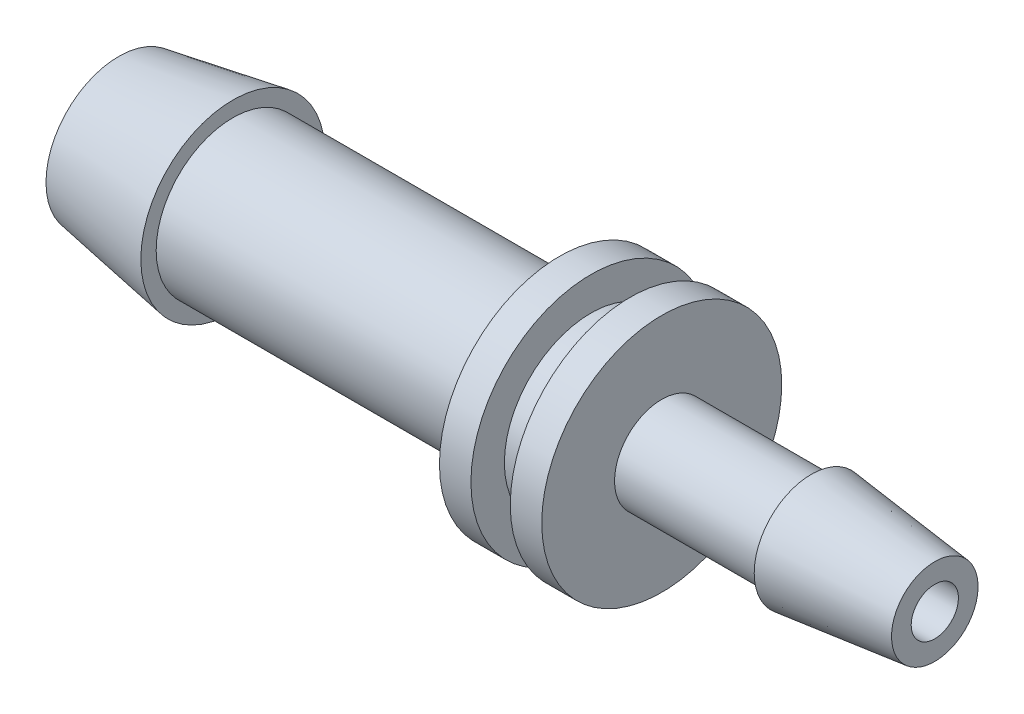
ISO-10303-21;
HEADER;
FILE_DESCRIPTION(('STEP AP214'),'2;1');
FILE_NAME('part.step','',(''),(''),'','','');
FILE_SCHEMA(('AUTOMOTIVE_DESIGN { 1 0 10303 214 1 1 1 1 }'));
ENDSEC;
DATA;
#1=APPLICATION_CONTEXT('core data for automotive mechanical design processes');
#2=APPLICATION_PROTOCOL_DEFINITION('international standard','automotive_design',2000,#1);
#3=PRODUCT_CONTEXT('',#1,'mechanical');
#4=PRODUCT('Part','Part','',(#3));
#5=PRODUCT_RELATED_PRODUCT_CATEGORY('part','',(#4));
#6=PRODUCT_DEFINITION_FORMATION('','',#4);
#7=PRODUCT_DEFINITION_CONTEXT('part definition',#1,'design');
#8=PRODUCT_DEFINITION('design','',#6,#7);
#9=PRODUCT_DEFINITION_SHAPE('','',#8);
#10=(LENGTH_UNIT() NAMED_UNIT(*) SI_UNIT(.MILLI.,.METRE.));
#11=(NAMED_UNIT(*) PLANE_ANGLE_UNIT() SI_UNIT($,.RADIAN.));
#12=(NAMED_UNIT(*) SI_UNIT($,.STERADIAN.) SOLID_ANGLE_UNIT());
#13=UNCERTAINTY_MEASURE_WITH_UNIT(LENGTH_MEASURE(1.E-05),#10,'distance_accuracy_value','');
#14=(GEOMETRIC_REPRESENTATION_CONTEXT(3) GLOBAL_UNCERTAINTY_ASSIGNED_CONTEXT((#13)) GLOBAL_UNIT_ASSIGNED_CONTEXT((#10,
#11,#12)) REPRESENTATION_CONTEXT('',''));
#15=CARTESIAN_POINT('',(0.,0.,0.));
#16=DIRECTION('',(0.,0.,1.));
#17=DIRECTION('',(1.,0.,0.));
#18=AXIS2_PLACEMENT_3D('',#15,#16,#17);
#19=CARTESIAN_POINT('',(3.683,2.9718,0.));
#20=DIRECTION('',(1.,0.,0.));
#21=DIRECTION('',(0.,0.,-1.));
#22=AXIS2_PLACEMENT_3D('',#19,#20,#21);
#23=PLANE('',#22);
#24=CARTESIAN_POINT('',(3.683,0.,0.));
#25=DIRECTION('',(-1.,0.,0.));
#26=DIRECTION('',(0.,0.,1.));
#27=AXIS2_PLACEMENT_3D('',#24,#25,#26);
#28=CIRCLE('',#27,2.4765);
#29=CARTESIAN_POINT('',(3.683,0.,2.4765));
#30=VERTEX_POINT('',#29);
#31=EDGE_CURVE('E447',#30,#30,#28,.T.);
#32=ORIENTED_EDGE('',*,*,#31,.T.);
#33=EDGE_LOOP('',(#32));
#34=FACE_BOUND('',#33,.T.);
#35=CARTESIAN_POINT('',(3.683,0.,0.));
#36=DIRECTION('',(-1.,0.,0.));
#37=DIRECTION('',(0.,0.,1.));
#38=AXIS2_PLACEMENT_3D('',#35,#36,#37);
#39=CIRCLE('',#38,2.9718);
#40=CARTESIAN_POINT('',(3.683,0.,2.9718));
#41=VERTEX_POINT('',#40);
#42=EDGE_CURVE('E11',#41,#41,#39,.T.);
#43=ORIENTED_EDGE('',*,*,#42,.F.);
#44=EDGE_LOOP('',(#43));
#45=FACE_BOUND('',#44,.T.);
#46=ADVANCED_FACE('F372',(#34,#45),#23,.T.);
#47=CARTESIAN_POINT('',(0.,0.,0.));
#48=DIRECTION('',(1.,0.,0.));
#49=DIRECTION('',(0.,0.,-1.));
#50=AXIS2_PLACEMENT_3D('',#47,#48,#49);
#51=CONICAL_SURFACE('',#50,2.3495,0.167384559658582);
#52=ORIENTED_EDGE('',*,*,#42,.T.);
#53=EDGE_LOOP('',(#52));
#54=FACE_BOUND('',#53,.T.);
#55=CARTESIAN_POINT('',(0.,0.,0.));
#56=DIRECTION('',(-1.,0.,0.));
#57=DIRECTION('',(0.,0.,1.));
#58=AXIS2_PLACEMENT_3D('',#55,#56,#57);
#59=CIRCLE('',#58,2.3495);
#60=CARTESIAN_POINT('',(0.,0.,2.3495));
#61=VERTEX_POINT('',#60);
#62=EDGE_CURVE('E381',#61,#61,#59,.T.);
#63=ORIENTED_EDGE('',*,*,#62,.F.);
#64=EDGE_LOOP('',(#63));
#65=FACE_BOUND('',#64,.T.);
#66=ADVANCED_FACE('F467',(#54,#65),#51,.T.);
#67=CARTESIAN_POINT('',(0.,2.3495,0.));
#68=DIRECTION('',(1.,0.,0.));
#69=DIRECTION('',(0.,0.,-1.));
#70=AXIS2_PLACEMENT_3D('',#67,#68,#69);
#71=PLANE('',#70);
#72=CARTESIAN_POINT('',(0.,0.,0.));
#73=DIRECTION('',(-1.,0.,0.));
#74=DIRECTION('',(0.,0.,1.));
#75=AXIS2_PLACEMENT_3D('',#72,#73,#74);
#76=CIRCLE('',#75,0.761999999999997);
#77=CARTESIAN_POINT('',(0.,0.,0.761999999999997));
#78=VERTEX_POINT('',#77);
#79=EDGE_CURVE('E386',#78,#78,#76,.T.);
#80=ORIENTED_EDGE('',*,*,#79,.F.);
#81=EDGE_LOOP('',(#80));
#82=FACE_BOUND('',#81,.T.);
#83=ORIENTED_EDGE('',*,*,#62,.T.);
#84=EDGE_LOOP('',(#83));
#85=FACE_BOUND('',#84,.T.);
#86=ADVANCED_FACE('F466',(#82,#85),#71,.F.);
#87=CARTESIAN_POINT('',(0.,0.,0.));
#88=DIRECTION('',(-1.,0.,0.));
#89=DIRECTION('',(0.,0.,1.));
#90=AXIS2_PLACEMENT_3D('',#87,#88,#89);
#91=CYLINDRICAL_SURFACE('',#90,0.761999999999998);
#92=ORIENTED_EDGE('',*,*,#79,.T.);
#93=EDGE_LOOP('',(#92));
#94=FACE_BOUND('',#93,.T.);
#95=CARTESIAN_POINT('',(26.3398,0.,0.));
#96=DIRECTION('',(-1.,0.,0.));
#97=DIRECTION('',(0.,0.,1.));
#98=AXIS2_PLACEMENT_3D('',#95,#96,#97);
#99=CIRCLE('',#98,0.762);
#100=CARTESIAN_POINT('',(26.3398,0.,0.762));
#101=VERTEX_POINT('',#100);
#102=EDGE_CURVE('E397',#101,#101,#99,.T.);
#103=ORIENTED_EDGE('',*,*,#102,.F.);
#104=EDGE_LOOP('',(#103));
#105=FACE_BOUND('',#104,.T.);
#106=ADVANCED_FACE('F475',(#94,#105),#91,.F.);
#107=CARTESIAN_POINT('',(26.3398,1.397,0.));
#108=DIRECTION('',(1.,0.,0.));
#109=DIRECTION('',(0.,0.,-1.));
#110=AXIS2_PLACEMENT_3D('',#107,#108,#109);
#111=PLANE('',#110);
#112=ORIENTED_EDGE('',*,*,#102,.T.);
#113=EDGE_LOOP('',(#112));
#114=FACE_BOUND('',#113,.T.);
#115=CARTESIAN_POINT('',(26.3398,0.,0.));
#116=DIRECTION('',(-1.,0.,0.));
#117=DIRECTION('',(0.,0.,1.));
#118=AXIS2_PLACEMENT_3D('',#115,#116,#117);
#119=CIRCLE('',#118,1.397);
#120=CARTESIAN_POINT('',(26.3398,0.,1.397));
#121=VERTEX_POINT('',#120);
#122=EDGE_CURVE('E405',#121,#121,#119,.T.);
#123=ORIENTED_EDGE('',*,*,#122,.F.);
#124=EDGE_LOOP('',(#123));
#125=FACE_BOUND('',#124,.T.);
#126=ADVANCED_FACE('F481',(#114,#125),#111,.T.);
#127=CARTESIAN_POINT('',(22.352,0.,0.));
#128=DIRECTION('',(-1.,0.,0.));
#129=DIRECTION('',(0.,0.,1.));
#130=AXIS2_PLACEMENT_3D('',#127,#128,#129);
#131=CONICAL_SURFACE('',#130,1.8415,0.111006749296676);
#132=ORIENTED_EDGE('',*,*,#122,.T.);
#133=EDGE_LOOP('',(#132));
#134=FACE_BOUND('',#133,.T.);
#135=CARTESIAN_POINT('',(22.352,0.,0.));
#136=DIRECTION('',(-1.,0.,0.));
#137=DIRECTION('',(0.,0.,1.));
#138=AXIS2_PLACEMENT_3D('',#135,#136,#137);
#139=CIRCLE('',#138,1.8415);
#140=CARTESIAN_POINT('',(22.352,0.,1.8415));
#141=VERTEX_POINT('',#140);
#142=EDGE_CURVE('E407',#141,#141,#139,.T.);
#143=ORIENTED_EDGE('',*,*,#142,.F.);
#144=EDGE_LOOP('',(#143));
#145=FACE_BOUND('',#144,.T.);
#146=ADVANCED_FACE('F484',(#134,#145),#131,.T.);
#147=CARTESIAN_POINT('',(22.352,1.524,0.));
#148=DIRECTION('',(-1.,0.,0.));
#149=DIRECTION('',(0.,0.,1.));
#150=AXIS2_PLACEMENT_3D('',#147,#148,#149);
#151=PLANE('',#150);
#152=ORIENTED_EDGE('',*,*,#142,.T.);
#153=EDGE_LOOP('',(#152));
#154=FACE_BOUND('',#153,.T.);
#155=CARTESIAN_POINT('',(22.352,0.,0.));
#156=DIRECTION('',(-1.,0.,0.));
#157=DIRECTION('',(0.,0.,1.));
#158=AXIS2_PLACEMENT_3D('',#155,#156,#157);
#159=CIRCLE('',#158,1.524);
#160=CARTESIAN_POINT('',(22.352,0.,1.524));
#161=VERTEX_POINT('',#160);
#162=EDGE_CURVE('E408',#161,#161,#159,.T.);
#163=ORIENTED_EDGE('',*,*,#162,.F.);
#164=EDGE_LOOP('',(#163));
#165=FACE_BOUND('',#164,.T.);
#166=ADVANCED_FACE('F487',(#154,#165),#151,.T.);
#167=CARTESIAN_POINT('',(0.,0.,0.));
#168=DIRECTION('',(-1.,0.,0.));
#169=DIRECTION('',(0.,0.,1.));
#170=AXIS2_PLACEMENT_3D('',#167,#168,#169);
#171=CYLINDRICAL_SURFACE('',#170,1.524);
#172=ORIENTED_EDGE('',*,*,#162,.T.);
#173=EDGE_LOOP('',(#172));
#174=FACE_BOUND('',#173,.T.);
#175=CARTESIAN_POINT('',(17.526,0.,0.));
#176=DIRECTION('',(-1.,0.,0.));
#177=DIRECTION('',(0.,0.,1.));
#178=AXIS2_PLACEMENT_3D('',#175,#176,#177);
#179=CIRCLE('',#178,1.524);
#180=CARTESIAN_POINT('',(17.526,0.,1.524));
#181=VERTEX_POINT('',#180);
#182=EDGE_CURVE('E414',#181,#181,#179,.T.);
#183=ORIENTED_EDGE('',*,*,#182,.F.);
#184=EDGE_LOOP('',(#183));
#185=FACE_BOUND('',#184,.T.);
#186=ADVANCED_FACE('F492',(#174,#185),#171,.T.);
#187=CARTESIAN_POINT('',(17.526,3.8735,0.));
#188=DIRECTION('',(1.,0.,0.));
#189=DIRECTION('',(0.,0.,-1.));
#190=AXIS2_PLACEMENT_3D('',#187,#188,#189);
#191=PLANE('',#190);
#192=ORIENTED_EDGE('',*,*,#182,.T.);
#193=EDGE_LOOP('',(#192));
#194=FACE_BOUND('',#193,.T.);
#195=CARTESIAN_POINT('',(17.526,0.,0.));
#196=DIRECTION('',(-1.,0.,0.));
#197=DIRECTION('',(0.,0.,1.));
#198=AXIS2_PLACEMENT_3D('',#195,#196,#197);
#199=CIRCLE('',#198,3.8735);
#200=CARTESIAN_POINT('',(17.526,0.,3.8735));
#201=VERTEX_POINT('',#200);
#202=EDGE_CURVE('E416',#201,#201,#199,.T.);
#203=ORIENTED_EDGE('',*,*,#202,.F.);
#204=EDGE_LOOP('',(#203));
#205=FACE_BOUND('',#204,.T.);
#206=ADVANCED_FACE('F500',(#194,#205),#191,.T.);
#207=CARTESIAN_POINT('',(0.,0.,0.));
#208=DIRECTION('',(-1.,0.,0.));
#209=DIRECTION('',(0.,0.,1.));
#210=AXIS2_PLACEMENT_3D('',#207,#208,#209);
#211=CYLINDRICAL_SURFACE('',#210,3.8735);
#212=ORIENTED_EDGE('',*,*,#202,.T.);
#213=EDGE_LOOP('',(#212));
#214=FACE_BOUND('',#213,.T.);
#215=CARTESIAN_POINT('',(16.51,0.,0.));
#216=DIRECTION('',(-1.,0.,0.));
#217=DIRECTION('',(0.,0.,1.));
#218=AXIS2_PLACEMENT_3D('',#215,#216,#217);
#219=CIRCLE('',#218,3.8735);
#220=CARTESIAN_POINT('',(16.51,0.,3.8735));
#221=VERTEX_POINT('',#220);
#222=EDGE_CURVE('E425',#221,#221,#219,.T.);
#223=ORIENTED_EDGE('',*,*,#222,.F.);
#224=EDGE_LOOP('',(#223));
#225=FACE_BOUND('',#224,.T.);
#226=ADVANCED_FACE('F502',(#214,#225),#211,.T.);
#227=CARTESIAN_POINT('',(16.51,2.794,0.));
#228=DIRECTION('',(-1.,0.,0.));
#229=DIRECTION('',(0.,0.,1.));
#230=AXIS2_PLACEMENT_3D('',#227,#228,#229);
#231=PLANE('',#230);
#232=ORIENTED_EDGE('',*,*,#222,.T.);
#233=EDGE_LOOP('',(#232));
#234=FACE_BOUND('',#233,.T.);
#235=CARTESIAN_POINT('',(16.51,0.,0.));
#236=DIRECTION('',(-1.,0.,0.));
#237=DIRECTION('',(0.,0.,1.));
#238=AXIS2_PLACEMENT_3D('',#235,#236,#237);
#239=CIRCLE('',#238,2.794);
#240=CARTESIAN_POINT('',(16.51,0.,2.794));
#241=VERTEX_POINT('',#240);
#242=EDGE_CURVE('E426',#241,#241,#239,.T.);
#243=ORIENTED_EDGE('',*,*,#242,.F.);
#244=EDGE_LOOP('',(#243));
#245=FACE_BOUND('',#244,.T.);
#246=ADVANCED_FACE('F503',(#234,#245),#231,.T.);
#247=CARTESIAN_POINT('',(0.,0.,0.));
#248=DIRECTION('',(-1.,0.,0.));
#249=DIRECTION('',(0.,0.,1.));
#250=AXIS2_PLACEMENT_3D('',#247,#248,#249);
#251=CYLINDRICAL_SURFACE('',#250,2.794);
#252=ORIENTED_EDGE('',*,*,#242,.T.);
#253=EDGE_LOOP('',(#252));
#254=FACE_BOUND('',#253,.T.);
#255=CARTESIAN_POINT('',(15.24,0.,0.));
#256=DIRECTION('',(-1.,0.,0.));
#257=DIRECTION('',(0.,0.,1.));
#258=AXIS2_PLACEMENT_3D('',#255,#256,#257);
#259=CIRCLE('',#258,2.794);
#260=CARTESIAN_POINT('',(15.24,0.,2.794));
#261=VERTEX_POINT('',#260);
#262=EDGE_CURVE('E429',#261,#261,#259,.T.);
#263=ORIENTED_EDGE('',*,*,#262,.F.);
#264=EDGE_LOOP('',(#263));
#265=FACE_BOUND('',#264,.T.);
#266=ADVANCED_FACE('F509',(#254,#265),#251,.T.);
#267=CARTESIAN_POINT('',(15.24,3.8735,0.));
#268=DIRECTION('',(1.,0.,0.));
#269=DIRECTION('',(0.,0.,-1.));
#270=AXIS2_PLACEMENT_3D('',#267,#268,#269);
#271=PLANE('',#270);
#272=ORIENTED_EDGE('',*,*,#262,.T.);
#273=EDGE_LOOP('',(#272));
#274=FACE_BOUND('',#273,.T.);
#275=CARTESIAN_POINT('',(15.24,0.,0.));
#276=DIRECTION('',(-1.,0.,0.));
#277=DIRECTION('',(0.,0.,1.));
#278=AXIS2_PLACEMENT_3D('',#275,#276,#277);
#279=CIRCLE('',#278,3.8735);
#280=CARTESIAN_POINT('',(15.24,0.,3.8735));
#281=VERTEX_POINT('',#280);
#282=EDGE_CURVE('E432',#281,#281,#279,.T.);
#283=ORIENTED_EDGE('',*,*,#282,.F.);
#284=EDGE_LOOP('',(#283));
#285=FACE_BOUND('',#284,.T.);
#286=ADVANCED_FACE('F511',(#274,#285),#271,.T.);
#287=CARTESIAN_POINT('',(0.,0.,0.));
#288=DIRECTION('',(-1.,0.,0.));
#289=DIRECTION('',(0.,0.,1.));
#290=AXIS2_PLACEMENT_3D('',#287,#288,#289);
#291=CYLINDRICAL_SURFACE('',#290,3.8735);
#292=ORIENTED_EDGE('',*,*,#282,.T.);
#293=EDGE_LOOP('',(#292));
#294=FACE_BOUND('',#293,.T.);
#295=CARTESIAN_POINT('',(14.224,0.,0.));
#296=DIRECTION('',(-1.,0.,0.));
#297=DIRECTION('',(0.,0.,1.));
#298=AXIS2_PLACEMENT_3D('',#295,#296,#297);
#299=CIRCLE('',#298,3.8735);
#300=CARTESIAN_POINT('',(14.224,0.,3.8735));
#301=VERTEX_POINT('',#300);
#302=EDGE_CURVE('E437',#301,#301,#299,.T.);
#303=ORIENTED_EDGE('',*,*,#302,.F.);
#304=EDGE_LOOP('',(#303));
#305=FACE_BOUND('',#304,.T.);
#306=ADVANCED_FACE('F465',(#294,#305),#291,.T.);
#307=CARTESIAN_POINT('',(14.224,2.4765,0.));
#308=DIRECTION('',(-1.,0.,0.));
#309=DIRECTION('',(0.,0.,1.));
#310=AXIS2_PLACEMENT_3D('',#307,#308,#309);
#311=PLANE('',#310);
#312=ORIENTED_EDGE('',*,*,#302,.T.);
#313=EDGE_LOOP('',(#312));
#314=FACE_BOUND('',#313,.T.);
#315=CARTESIAN_POINT('',(14.224,0.,0.));
#316=DIRECTION('',(-1.,0.,0.));
#317=DIRECTION('',(0.,0.,1.));
#318=AXIS2_PLACEMENT_3D('',#315,#316,#317);
#319=CIRCLE('',#318,2.4765);
#320=CARTESIAN_POINT('',(14.224,0.,2.4765));
#321=VERTEX_POINT('',#320);
#322=EDGE_CURVE('E445',#321,#321,#319,.T.);
#323=ORIENTED_EDGE('',*,*,#322,.F.);
#324=EDGE_LOOP('',(#323));
#325=FACE_BOUND('',#324,.T.);
#326=ADVANCED_FACE('F457',(#314,#325),#311,.T.);
#327=CARTESIAN_POINT('',(0.,0.,0.));
#328=DIRECTION('',(-1.,0.,0.));
#329=DIRECTION('',(0.,0.,1.));
#330=AXIS2_PLACEMENT_3D('',#327,#328,#329);
#331=CYLINDRICAL_SURFACE('',#330,2.4765);
#332=ORIENTED_EDGE('',*,*,#322,.T.);
#333=EDGE_LOOP('',(#332));
#334=FACE_BOUND('',#333,.T.);
#335=ORIENTED_EDGE('',*,*,#31,.F.);
#336=EDGE_LOOP('',(#335));
#337=FACE_BOUND('',#336,.T.);
#338=ADVANCED_FACE('F454',(#334,#337),#331,.T.);
#339=CLOSED_SHELL('',(#46,#66,#86,#106,#126,#146,#166,#186,#206,#226,#246,#266,#286,#306,#326,#338));
#340=MANIFOLD_SOLID_BREP('B2',#339);
#341=ADVANCED_BREP_SHAPE_REPRESENTATION('',(#18,#340),#14);
#342=SHAPE_DEFINITION_REPRESENTATION(#9,#341);
ENDSEC;
END-ISO-10303-21;
